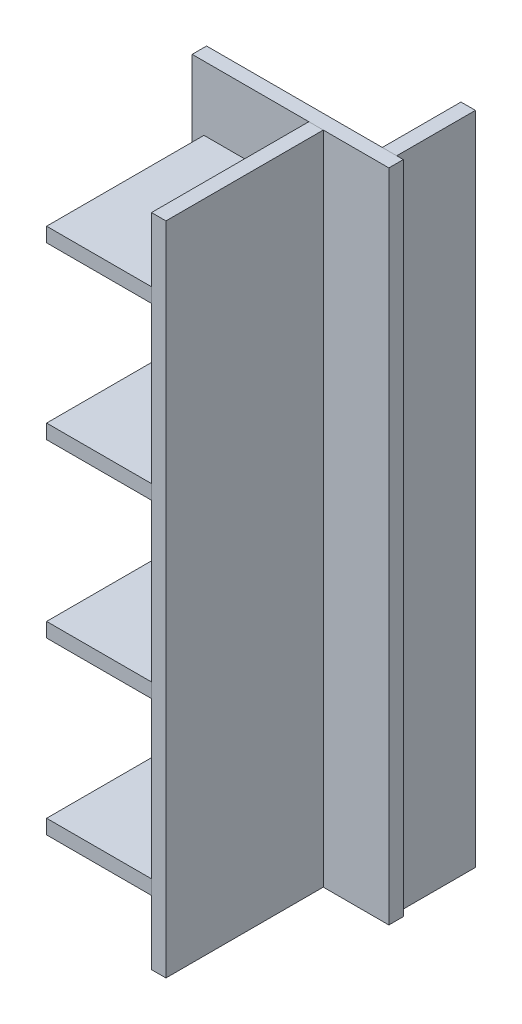
ISO-10303-21;
HEADER;
FILE_DESCRIPTION(('STEP AP214'),'2;1');
FILE_NAME('part.step','',(''),(''),'','','');
FILE_SCHEMA(('AUTOMOTIVE_DESIGN { 1 0 10303 214 1 1 1 1 }'));
ENDSEC;
DATA;
#1=APPLICATION_CONTEXT('core data for automotive mechanical design processes');
#2=APPLICATION_PROTOCOL_DEFINITION('international standard','automotive_design',2000,#1);
#3=PRODUCT_CONTEXT('',#1,'mechanical');
#4=PRODUCT('Part','Part','',(#3));
#5=PRODUCT_RELATED_PRODUCT_CATEGORY('part','',(#4));
#6=PRODUCT_DEFINITION_FORMATION('','',#4);
#7=PRODUCT_DEFINITION_CONTEXT('part definition',#1,'design');
#8=PRODUCT_DEFINITION('design','',#6,#7);
#9=PRODUCT_DEFINITION_SHAPE('','',#8);
#10=(LENGTH_UNIT() NAMED_UNIT(*) SI_UNIT(.MILLI.,.METRE.));
#11=(NAMED_UNIT(*) PLANE_ANGLE_UNIT() SI_UNIT($,.RADIAN.));
#12=(NAMED_UNIT(*) SI_UNIT($,.STERADIAN.) SOLID_ANGLE_UNIT());
#13=UNCERTAINTY_MEASURE_WITH_UNIT(LENGTH_MEASURE(1.E-05),#10,'distance_accuracy_value','');
#14=(GEOMETRIC_REPRESENTATION_CONTEXT(3) GLOBAL_UNCERTAINTY_ASSIGNED_CONTEXT((#13)) GLOBAL_UNIT_ASSIGNED_CONTEXT((#10,
#11,#12)) REPRESENTATION_CONTEXT('',''));
#15=CARTESIAN_POINT('',(0.,0.,0.));
#16=DIRECTION('',(0.,0.,1.));
#17=DIRECTION('',(1.,0.,0.));
#18=AXIS2_PLACEMENT_3D('',#15,#16,#17);
#19=CARTESIAN_POINT('',(140.,500.,-120.));
#20=DIRECTION('',(-1.,0.,0.));
#21=DIRECTION('',(0.,-1.,0.));
#22=AXIS2_PLACEMENT_3D('',#19,#20,#21);
#23=PLANE('',#22);
#24=DIRECTION('',(0.,-1.,0.));
#25=VECTOR('',#24,1.);
#26=CARTESIAN_POINT('',(140.,500.,0.));
#27=LINE('',#26,#25);
#28=CARTESIAN_POINT('',(140.,500.,0.));
#29=VERTEX_POINT('',#28);
#30=CARTESIAN_POINT('',(140.,-500.,0.));
#31=VERTEX_POINT('',#30);
#32=EDGE_CURVE('E107',#29,#31,#27,.T.);
#33=ORIENTED_EDGE('',*,*,#32,.T.);
#34=DIRECTION('',(0.,0.,1.));
#35=VECTOR('',#34,1.);
#36=CARTESIAN_POINT('',(140.,-500.,-120.));
#37=LINE('',#36,#35);
#38=CARTESIAN_POINT('',(140.,-500.,-120.));
#39=VERTEX_POINT('',#38);
#40=EDGE_CURVE('E12',#39,#31,#37,.T.);
#41=ORIENTED_EDGE('',*,*,#40,.F.);
#42=DIRECTION('',(0.,-1.,0.));
#43=VECTOR('',#42,1.);
#44=CARTESIAN_POINT('',(140.,500.,-120.));
#45=LINE('',#44,#43);
#46=CARTESIAN_POINT('',(140.,500.,-120.));
#47=VERTEX_POINT('',#46);
#48=EDGE_CURVE('E95',#47,#39,#45,.T.);
#49=ORIENTED_EDGE('',*,*,#48,.F.);
#50=DIRECTION('',(0.,0.,1.));
#51=VECTOR('',#50,1.);
#52=CARTESIAN_POINT('',(140.,500.,-120.));
#53=LINE('',#52,#51);
#54=EDGE_CURVE('E103',#47,#29,#53,.T.);
#55=ORIENTED_EDGE('',*,*,#54,.T.);
#56=EDGE_LOOP('',(#33,#41,#49,#55));
#57=FACE_BOUND('',#56,.T.);
#58=ADVANCED_FACE('F44',(#57),#23,.F.);
#59=CARTESIAN_POINT('',(140.,-500.,-120.));
#60=DIRECTION('',(0.,1.,0.));
#61=DIRECTION('',(0.,0.,1.));
#62=AXIS2_PLACEMENT_3D('',#59,#60,#61);
#63=PLANE('',#62);
#64=DIRECTION('',(-1.,0.,0.));
#65=VECTOR('',#64,1.);
#66=CARTESIAN_POINT('',(140.,-500.,0.));
#67=LINE('',#66,#65);
#68=CARTESIAN_POINT('',(118.,-500.,0.));
#69=VERTEX_POINT('',#68);
#70=EDGE_CURVE('E99',#31,#69,#67,.T.);
#71=ORIENTED_EDGE('',*,*,#70,.T.);
#72=DIRECTION('',(0.,0.,1.));
#73=VECTOR('',#72,1.);
#74=CARTESIAN_POINT('',(118.,-500.,-120.));
#75=LINE('',#74,#73);
#76=CARTESIAN_POINT('',(118.,-500.,-120.));
#77=VERTEX_POINT('',#76);
#78=EDGE_CURVE('E52',#77,#69,#75,.T.);
#79=ORIENTED_EDGE('',*,*,#78,.F.);
#80=DIRECTION('',(-1.,0.,0.));
#81=VECTOR('',#80,1.);
#82=CARTESIAN_POINT('',(140.,-500.,-120.));
#83=LINE('',#82,#81);
#84=EDGE_CURVE('E90',#39,#77,#83,.T.);
#85=ORIENTED_EDGE('',*,*,#84,.F.);
#86=ORIENTED_EDGE('',*,*,#40,.T.);
#87=EDGE_LOOP('',(#71,#79,#85,#86));
#88=FACE_BOUND('',#87,.T.);
#89=ADVANCED_FACE('F98',(#88),#63,.F.);
#90=CARTESIAN_POINT('',(118.,500.,-120.));
#91=DIRECTION('',(1.,0.,0.));
#92=DIRECTION('',(0.,1.,0.));
#93=AXIS2_PLACEMENT_3D('',#90,#91,#92);
#94=PLANE('',#93);
#95=DIRECTION('',(0.,1.,0.));
#96=VECTOR('',#95,1.);
#97=CARTESIAN_POINT('',(118.,500.,0.));
#98=LINE('',#97,#96);
#99=CARTESIAN_POINT('',(118.,500.,0.));
#100=VERTEX_POINT('',#99);
#101=EDGE_CURVE('E77',#69,#100,#98,.T.);
#102=ORIENTED_EDGE('',*,*,#101,.T.);
#103=DIRECTION('',(0.,0.,1.));
#104=VECTOR('',#103,1.);
#105=CARTESIAN_POINT('',(118.,500.,-120.));
#106=LINE('',#105,#104);
#107=CARTESIAN_POINT('',(118.,500.,-120.));
#108=VERTEX_POINT('',#107);
#109=EDGE_CURVE('E100',#108,#100,#106,.T.);
#110=ORIENTED_EDGE('',*,*,#109,.F.);
#111=DIRECTION('',(0.,1.,0.));
#112=VECTOR('',#111,1.);
#113=CARTESIAN_POINT('',(118.,500.,-120.));
#114=LINE('',#113,#112);
#115=EDGE_CURVE('E93',#77,#108,#114,.T.);
#116=ORIENTED_EDGE('',*,*,#115,.F.);
#117=ORIENTED_EDGE('',*,*,#78,.T.);
#118=EDGE_LOOP('',(#102,#110,#116,#117));
#119=FACE_BOUND('',#118,.T.);
#120=ADVANCED_FACE('F101',(#119),#94,.F.);
#121=CARTESIAN_POINT('',(140.,500.,-120.));
#122=DIRECTION('',(0.,-1.,0.));
#123=DIRECTION('',(0.,0.,-1.));
#124=AXIS2_PLACEMENT_3D('',#121,#122,#123);
#125=PLANE('',#124);
#126=DIRECTION('',(1.,0.,0.));
#127=VECTOR('',#126,1.);
#128=CARTESIAN_POINT('',(140.,500.,0.));
#129=LINE('',#128,#127);
#130=EDGE_CURVE('E83',#100,#29,#129,.T.);
#131=ORIENTED_EDGE('',*,*,#130,.T.);
#132=ORIENTED_EDGE('',*,*,#54,.F.);
#133=DIRECTION('',(1.,0.,0.));
#134=VECTOR('',#133,1.);
#135=CARTESIAN_POINT('',(140.,500.,-120.));
#136=LINE('',#135,#134);
#137=EDGE_CURVE('E60',#108,#47,#136,.T.);
#138=ORIENTED_EDGE('',*,*,#137,.F.);
#139=ORIENTED_EDGE('',*,*,#109,.T.);
#140=EDGE_LOOP('',(#131,#132,#138,#139));
#141=FACE_BOUND('',#140,.T.);
#142=ADVANCED_FACE('F114',(#141),#125,.F.);
#143=CARTESIAN_POINT('',(0.,0.,-120.));
#144=DIRECTION('',(0.,0.,-1.));
#145=DIRECTION('',(-1.,0.,0.));
#146=AXIS2_PLACEMENT_3D('',#143,#144,#145);
#147=PLANE('',#146);
#148=ORIENTED_EDGE('',*,*,#48,.T.);
#149=ORIENTED_EDGE('',*,*,#84,.T.);
#150=ORIENTED_EDGE('',*,*,#115,.T.);
#151=ORIENTED_EDGE('',*,*,#137,.T.);
#152=EDGE_LOOP('',(#148,#149,#150,#151));
#153=FACE_BOUND('',#152,.T.);
#154=ADVANCED_FACE('F91',(#153),#147,.T.);
#155=CARTESIAN_POINT('',(0.,0.,0.));
#156=DIRECTION('',(0.,0.,-1.));
#157=DIRECTION('',(-1.,0.,0.));
#158=AXIS2_PLACEMENT_3D('',#155,#156,#157);
#159=PLANE('',#158);
#160=ORIENTED_EDGE('',*,*,#32,.F.);
#161=ORIENTED_EDGE('',*,*,#130,.F.);
#162=ORIENTED_EDGE('',*,*,#101,.F.);
#163=ORIENTED_EDGE('',*,*,#70,.F.);
#164=EDGE_LOOP('',(#160,#161,#162,#163));
#165=FACE_BOUND('',#164,.T.);
#166=ADVANCED_FACE('F117',(#165),#159,.F.);
#167=CLOSED_SHELL('',(#58,#89,#120,#142,#154,#166));
#168=MANIFOLD_SOLID_BREP('B2',#167);
#169=CARTESIAN_POINT('',(27.9999999999999,142.,262.));
#170=DIRECTION('',(0.,-1.,0.));
#171=DIRECTION('',(0.,0.,-1.));
#172=AXIS2_PLACEMENT_3D('',#169,#170,#171);
#173=PLANE('',#172);
#174=DIRECTION('',(-1.,0.,0.));
#175=VECTOR('',#174,1.);
#176=CARTESIAN_POINT('',(27.9999999999999,142.,22.));
#177=LINE('',#176,#175);
#178=CARTESIAN_POINT('',(27.9999999999999,142.,22.));
#179=VERTEX_POINT('',#178);
#180=CARTESIAN_POINT('',(-132.,142.,22.));
#181=VERTEX_POINT('',#180);
#182=EDGE_CURVE('E241',#179,#181,#177,.T.);
#183=ORIENTED_EDGE('',*,*,#182,.T.);
#184=DIRECTION('',(0.,0.,-1.));
#185=VECTOR('',#184,1.);
#186=CARTESIAN_POINT('',(-132.,142.,262.));
#187=LINE('',#186,#185);
#188=CARTESIAN_POINT('',(-132.,142.,262.));
#189=VERTEX_POINT('',#188);
#190=EDGE_CURVE('E42',#189,#181,#187,.T.);
#191=ORIENTED_EDGE('',*,*,#190,.F.);
#192=DIRECTION('',(-1.,0.,0.));
#193=VECTOR('',#192,1.);
#194=CARTESIAN_POINT('',(27.9999999999999,142.,262.));
#195=LINE('',#194,#193);
#196=CARTESIAN_POINT('',(27.9999999999999,142.,262.));
#197=VERTEX_POINT('',#196);
#198=EDGE_CURVE('E229',#197,#189,#195,.T.);
#199=ORIENTED_EDGE('',*,*,#198,.F.);
#200=DIRECTION('',(0.,0.,-1.));
#201=VECTOR('',#200,1.);
#202=CARTESIAN_POINT('',(27.9999999999999,142.,262.));
#203=LINE('',#202,#201);
#204=EDGE_CURVE('E237',#197,#179,#203,.T.);
#205=ORIENTED_EDGE('',*,*,#204,.T.);
#206=EDGE_LOOP('',(#183,#191,#199,#205));
#207=FACE_BOUND('',#206,.T.);
#208=ADVANCED_FACE('F178',(#207),#173,.F.);
#209=CARTESIAN_POINT('',(-132.,142.,262.));
#210=DIRECTION('',(1.,0.,0.));
#211=DIRECTION('',(0.,0.,-1.));
#212=AXIS2_PLACEMENT_3D('',#209,#210,#211);
#213=PLANE('',#212);
#214=DIRECTION('',(0.,-1.,0.));
#215=VECTOR('',#214,1.);
#216=CARTESIAN_POINT('',(-132.,142.,22.));
#217=LINE('',#216,#215);
#218=CARTESIAN_POINT('',(-132.,120.,22.));
#219=VERTEX_POINT('',#218);
#220=EDGE_CURVE('E233',#181,#219,#217,.T.);
#221=ORIENTED_EDGE('',*,*,#220,.T.);
#222=DIRECTION('',(0.,0.,-1.));
#223=VECTOR('',#222,1.);
#224=CARTESIAN_POINT('',(-132.,120.,262.));
#225=LINE('',#224,#223);
#226=CARTESIAN_POINT('',(-132.,120.,262.));
#227=VERTEX_POINT('',#226);
#228=EDGE_CURVE('E186',#227,#219,#225,.T.);
#229=ORIENTED_EDGE('',*,*,#228,.F.);
#230=DIRECTION('',(0.,-1.,0.));
#231=VECTOR('',#230,1.);
#232=CARTESIAN_POINT('',(-132.,142.,262.));
#233=LINE('',#232,#231);
#234=EDGE_CURVE('E224',#189,#227,#233,.T.);
#235=ORIENTED_EDGE('',*,*,#234,.F.);
#236=ORIENTED_EDGE('',*,*,#190,.T.);
#237=EDGE_LOOP('',(#221,#229,#235,#236));
#238=FACE_BOUND('',#237,.T.);
#239=ADVANCED_FACE('F232',(#238),#213,.F.);
#240=CARTESIAN_POINT('',(27.9999999999999,120.,262.));
#241=DIRECTION('',(0.,1.,0.));
#242=DIRECTION('',(-1.,0.,0.));
#243=AXIS2_PLACEMENT_3D('',#240,#241,#242);
#244=PLANE('',#243);
#245=DIRECTION('',(1.,0.,0.));
#246=VECTOR('',#245,1.);
#247=CARTESIAN_POINT('',(27.9999999999999,120.,22.));
#248=LINE('',#247,#246);
#249=CARTESIAN_POINT('',(27.9999999999999,120.,22.));
#250=VERTEX_POINT('',#249);
#251=EDGE_CURVE('E211',#219,#250,#248,.T.);
#252=ORIENTED_EDGE('',*,*,#251,.T.);
#253=DIRECTION('',(0.,0.,-1.));
#254=VECTOR('',#253,1.);
#255=CARTESIAN_POINT('',(27.9999999999999,120.,262.));
#256=LINE('',#255,#254);
#257=CARTESIAN_POINT('',(27.9999999999999,120.,262.));
#258=VERTEX_POINT('',#257);
#259=EDGE_CURVE('E234',#258,#250,#256,.T.);
#260=ORIENTED_EDGE('',*,*,#259,.F.);
#261=DIRECTION('',(1.,0.,0.));
#262=VECTOR('',#261,1.);
#263=CARTESIAN_POINT('',(27.9999999999999,120.,262.));
#264=LINE('',#263,#262);
#265=EDGE_CURVE('E227',#227,#258,#264,.T.);
#266=ORIENTED_EDGE('',*,*,#265,.F.);
#267=ORIENTED_EDGE('',*,*,#228,.T.);
#268=EDGE_LOOP('',(#252,#260,#266,#267));
#269=FACE_BOUND('',#268,.T.);
#270=ADVANCED_FACE('F235',(#269),#244,.F.);
#271=CARTESIAN_POINT('',(27.9999999999999,142.,262.));
#272=DIRECTION('',(-1.,0.,0.));
#273=DIRECTION('',(0.,0.,1.));
#274=AXIS2_PLACEMENT_3D('',#271,#272,#273);
#275=PLANE('',#274);
#276=DIRECTION('',(0.,1.,0.));
#277=VECTOR('',#276,1.);
#278=CARTESIAN_POINT('',(27.9999999999999,142.,22.));
#279=LINE('',#278,#277);
#280=EDGE_CURVE('E217',#250,#179,#279,.T.);
#281=ORIENTED_EDGE('',*,*,#280,.T.);
#282=ORIENTED_EDGE('',*,*,#204,.F.);
#283=DIRECTION('',(0.,1.,0.));
#284=VECTOR('',#283,1.);
#285=CARTESIAN_POINT('',(27.9999999999999,142.,262.));
#286=LINE('',#285,#284);
#287=EDGE_CURVE('E194',#258,#197,#286,.T.);
#288=ORIENTED_EDGE('',*,*,#287,.F.);
#289=ORIENTED_EDGE('',*,*,#259,.T.);
#290=EDGE_LOOP('',(#281,#282,#288,#289));
#291=FACE_BOUND('',#290,.T.);
#292=ADVANCED_FACE('F248',(#291),#275,.F.);
#293=CARTESIAN_POINT('',(0.,0.,262.));
#294=DIRECTION('',(0.,0.,1.));
#295=DIRECTION('',(1.,0.,0.));
#296=AXIS2_PLACEMENT_3D('',#293,#294,#295);
#297=PLANE('',#296);
#298=ORIENTED_EDGE('',*,*,#198,.T.);
#299=ORIENTED_EDGE('',*,*,#234,.T.);
#300=ORIENTED_EDGE('',*,*,#265,.T.);
#301=ORIENTED_EDGE('',*,*,#287,.T.);
#302=EDGE_LOOP('',(#298,#299,#300,#301));
#303=FACE_BOUND('',#302,.T.);
#304=ADVANCED_FACE('F225',(#303),#297,.T.);
#305=CARTESIAN_POINT('',(0.,0.,22.));
#306=DIRECTION('',(0.,0.,1.));
#307=DIRECTION('',(1.,0.,0.));
#308=AXIS2_PLACEMENT_3D('',#305,#306,#307);
#309=PLANE('',#308);
#310=ORIENTED_EDGE('',*,*,#182,.F.);
#311=ORIENTED_EDGE('',*,*,#280,.F.);
#312=ORIENTED_EDGE('',*,*,#251,.F.);
#313=ORIENTED_EDGE('',*,*,#220,.F.);
#314=EDGE_LOOP('',(#310,#311,#312,#313));
#315=FACE_BOUND('',#314,.T.);
#316=ADVANCED_FACE('F251',(#315),#309,.F.);
#317=CLOSED_SHELL('',(#208,#239,#270,#292,#304,#316));
#318=MANIFOLD_SOLID_BREP('B6',#317);
#319=CARTESIAN_POINT('',(27.9999999999999,402.,262.));
#320=DIRECTION('',(0.,-1.,0.));
#321=DIRECTION('',(0.,0.,-1.));
#322=AXIS2_PLACEMENT_3D('',#319,#320,#321);
#323=PLANE('',#322);
#324=DIRECTION('',(-1.,0.,0.));
#325=VECTOR('',#324,1.);
#326=CARTESIAN_POINT('',(27.9999999999999,402.,22.));
#327=LINE('',#326,#325);
#328=CARTESIAN_POINT('',(27.9999999999999,402.,22.));
#329=VERTEX_POINT('',#328);
#330=CARTESIAN_POINT('',(-132.,402.,22.));
#331=VERTEX_POINT('',#330);
#332=EDGE_CURVE('E375',#329,#331,#327,.T.);
#333=ORIENTED_EDGE('',*,*,#332,.T.);
#334=DIRECTION('',(0.,0.,-1.));
#335=VECTOR('',#334,1.);
#336=CARTESIAN_POINT('',(-132.,402.,262.));
#337=LINE('',#336,#335);
#338=CARTESIAN_POINT('',(-132.,402.,262.));
#339=VERTEX_POINT('',#338);
#340=EDGE_CURVE('E176',#339,#331,#337,.T.);
#341=ORIENTED_EDGE('',*,*,#340,.F.);
#342=DIRECTION('',(-1.,0.,0.));
#343=VECTOR('',#342,1.);
#344=CARTESIAN_POINT('',(27.9999999999999,402.,262.));
#345=LINE('',#344,#343);
#346=CARTESIAN_POINT('',(27.9999999999999,402.,262.));
#347=VERTEX_POINT('',#346);
#348=EDGE_CURVE('E363',#347,#339,#345,.T.);
#349=ORIENTED_EDGE('',*,*,#348,.F.);
#350=DIRECTION('',(0.,0.,-1.));
#351=VECTOR('',#350,1.);
#352=CARTESIAN_POINT('',(27.9999999999999,402.,262.));
#353=LINE('',#352,#351);
#354=EDGE_CURVE('E371',#347,#329,#353,.T.);
#355=ORIENTED_EDGE('',*,*,#354,.T.);
#356=EDGE_LOOP('',(#333,#341,#349,#355));
#357=FACE_BOUND('',#356,.T.);
#358=ADVANCED_FACE('F312',(#357),#323,.F.);
#359=CARTESIAN_POINT('',(-132.,402.,262.));
#360=DIRECTION('',(1.,0.,0.));
#361=DIRECTION('',(0.,0.,-1.));
#362=AXIS2_PLACEMENT_3D('',#359,#360,#361);
#363=PLANE('',#362);
#364=DIRECTION('',(0.,-1.,0.));
#365=VECTOR('',#364,1.);
#366=CARTESIAN_POINT('',(-132.,402.,22.));
#367=LINE('',#366,#365);
#368=CARTESIAN_POINT('',(-132.,380.,22.));
#369=VERTEX_POINT('',#368);
#370=EDGE_CURVE('E367',#331,#369,#367,.T.);
#371=ORIENTED_EDGE('',*,*,#370,.T.);
#372=DIRECTION('',(0.,0.,-1.));
#373=VECTOR('',#372,1.);
#374=CARTESIAN_POINT('',(-132.,380.,262.));
#375=LINE('',#374,#373);
#376=CARTESIAN_POINT('',(-132.,380.,262.));
#377=VERTEX_POINT('',#376);
#378=EDGE_CURVE('E320',#377,#369,#375,.T.);
#379=ORIENTED_EDGE('',*,*,#378,.F.);
#380=DIRECTION('',(0.,-1.,0.));
#381=VECTOR('',#380,1.);
#382=CARTESIAN_POINT('',(-132.,402.,262.));
#383=LINE('',#382,#381);
#384=EDGE_CURVE('E358',#339,#377,#383,.T.);
#385=ORIENTED_EDGE('',*,*,#384,.F.);
#386=ORIENTED_EDGE('',*,*,#340,.T.);
#387=EDGE_LOOP('',(#371,#379,#385,#386));
#388=FACE_BOUND('',#387,.T.);
#389=ADVANCED_FACE('F366',(#388),#363,.F.);
#390=CARTESIAN_POINT('',(27.9999999999999,380.,262.));
#391=DIRECTION('',(0.,1.,0.));
#392=DIRECTION('',(0.,0.,1.));
#393=AXIS2_PLACEMENT_3D('',#390,#391,#392);
#394=PLANE('',#393);
#395=DIRECTION('',(1.,0.,0.));
#396=VECTOR('',#395,1.);
#397=CARTESIAN_POINT('',(27.9999999999999,380.,22.));
#398=LINE('',#397,#396);
#399=CARTESIAN_POINT('',(27.9999999999999,380.,22.));
#400=VERTEX_POINT('',#399);
#401=EDGE_CURVE('E345',#369,#400,#398,.T.);
#402=ORIENTED_EDGE('',*,*,#401,.T.);
#403=DIRECTION('',(0.,0.,-1.));
#404=VECTOR('',#403,1.);
#405=CARTESIAN_POINT('',(27.9999999999999,380.,262.));
#406=LINE('',#405,#404);
#407=CARTESIAN_POINT('',(27.9999999999999,380.,262.));
#408=VERTEX_POINT('',#407);
#409=EDGE_CURVE('E368',#408,#400,#406,.T.);
#410=ORIENTED_EDGE('',*,*,#409,.F.);
#411=DIRECTION('',(1.,0.,0.));
#412=VECTOR('',#411,1.);
#413=CARTESIAN_POINT('',(27.9999999999999,380.,262.));
#414=LINE('',#413,#412);
#415=EDGE_CURVE('E361',#377,#408,#414,.T.);
#416=ORIENTED_EDGE('',*,*,#415,.F.);
#417=ORIENTED_EDGE('',*,*,#378,.T.);
#418=EDGE_LOOP('',(#402,#410,#416,#417));
#419=FACE_BOUND('',#418,.T.);
#420=ADVANCED_FACE('F369',(#419),#394,.F.);
#421=CARTESIAN_POINT('',(27.9999999999999,402.,262.));
#422=DIRECTION('',(-1.,0.,0.));
#423=DIRECTION('',(0.,0.,1.));
#424=AXIS2_PLACEMENT_3D('',#421,#422,#423);
#425=PLANE('',#424);
#426=DIRECTION('',(0.,1.,0.));
#427=VECTOR('',#426,1.);
#428=CARTESIAN_POINT('',(27.9999999999999,402.,22.));
#429=LINE('',#428,#427);
#430=EDGE_CURVE('E351',#400,#329,#429,.T.);
#431=ORIENTED_EDGE('',*,*,#430,.T.);
#432=ORIENTED_EDGE('',*,*,#354,.F.);
#433=DIRECTION('',(0.,1.,0.));
#434=VECTOR('',#433,1.);
#435=CARTESIAN_POINT('',(27.9999999999999,402.,262.));
#436=LINE('',#435,#434);
#437=EDGE_CURVE('E328',#408,#347,#436,.T.);
#438=ORIENTED_EDGE('',*,*,#437,.F.);
#439=ORIENTED_EDGE('',*,*,#409,.T.);
#440=EDGE_LOOP('',(#431,#432,#438,#439));
#441=FACE_BOUND('',#440,.T.);
#442=ADVANCED_FACE('F382',(#441),#425,.F.);
#443=CARTESIAN_POINT('',(0.,0.,262.));
#444=DIRECTION('',(0.,0.,1.));
#445=DIRECTION('',(1.,0.,0.));
#446=AXIS2_PLACEMENT_3D('',#443,#444,#445);
#447=PLANE('',#446);
#448=ORIENTED_EDGE('',*,*,#348,.T.);
#449=ORIENTED_EDGE('',*,*,#384,.T.);
#450=ORIENTED_EDGE('',*,*,#415,.T.);
#451=ORIENTED_EDGE('',*,*,#437,.T.);
#452=EDGE_LOOP('',(#448,#449,#450,#451));
#453=FACE_BOUND('',#452,.T.);
#454=ADVANCED_FACE('F359',(#453),#447,.T.);
#455=CARTESIAN_POINT('',(0.,0.,22.));
#456=DIRECTION('',(0.,0.,1.));
#457=DIRECTION('',(1.,0.,0.));
#458=AXIS2_PLACEMENT_3D('',#455,#456,#457);
#459=PLANE('',#458);
#460=ORIENTED_EDGE('',*,*,#332,.F.);
#461=ORIENTED_EDGE('',*,*,#430,.F.);
#462=ORIENTED_EDGE('',*,*,#401,.F.);
#463=ORIENTED_EDGE('',*,*,#370,.F.);
#464=EDGE_LOOP('',(#460,#461,#462,#463));
#465=FACE_BOUND('',#464,.T.);
#466=ADVANCED_FACE('F385',(#465),#459,.F.);
#467=CLOSED_SHELL('',(#358,#389,#420,#442,#454,#466));
#468=MANIFOLD_SOLID_BREP('B36',#467);
#469=CARTESIAN_POINT('',(27.9999999999999,-142.,262.));
#470=DIRECTION('',(-1.,0.,0.));
#471=DIRECTION('',(0.,0.,1.));
#472=AXIS2_PLACEMENT_3D('',#469,#470,#471);
#473=PLANE('',#472);
#474=DIRECTION('',(0.,1.,0.));
#475=VECTOR('',#474,1.);
#476=CARTESIAN_POINT('',(27.9999999999999,-142.,22.));
#477=LINE('',#476,#475);
#478=CARTESIAN_POINT('',(27.9999999999999,-142.,22.));
#479=VERTEX_POINT('',#478);
#480=CARTESIAN_POINT('',(27.9999999999999,-120.,22.));
#481=VERTEX_POINT('',#480);
#482=EDGE_CURVE('E509',#479,#481,#477,.T.);
#483=ORIENTED_EDGE('',*,*,#482,.T.);
#484=DIRECTION('',(0.,0.,-1.));
#485=VECTOR('',#484,1.);
#486=CARTESIAN_POINT('',(27.9999999999999,-120.,262.));
#487=LINE('',#486,#485);
#488=CARTESIAN_POINT('',(27.9999999999999,-120.,262.));
#489=VERTEX_POINT('',#488);
#490=EDGE_CURVE('E310',#489,#481,#487,.T.);
#491=ORIENTED_EDGE('',*,*,#490,.F.);
#492=DIRECTION('',(0.,1.,0.));
#493=VECTOR('',#492,1.);
#494=CARTESIAN_POINT('',(27.9999999999999,-142.,262.));
#495=LINE('',#494,#493);
#496=CARTESIAN_POINT('',(27.9999999999999,-142.,262.));
#497=VERTEX_POINT('',#496);
#498=EDGE_CURVE('E497',#497,#489,#495,.T.);
#499=ORIENTED_EDGE('',*,*,#498,.F.);
#500=DIRECTION('',(0.,0.,-1.));
#501=VECTOR('',#500,1.);
#502=CARTESIAN_POINT('',(27.9999999999999,-142.,262.));
#503=LINE('',#502,#501);
#504=EDGE_CURVE('E505',#497,#479,#503,.T.);
#505=ORIENTED_EDGE('',*,*,#504,.T.);
#506=EDGE_LOOP('',(#483,#491,#499,#505));
#507=FACE_BOUND('',#506,.T.);
#508=ADVANCED_FACE('F446',(#507),#473,.F.);
#509=CARTESIAN_POINT('',(27.9999999999999,-120.,262.));
#510=DIRECTION('',(0.,-1.,0.));
#511=DIRECTION('',(1.,0.,0.));
#512=AXIS2_PLACEMENT_3D('',#509,#510,#511);
#513=PLANE('',#512);
#514=DIRECTION('',(-1.,0.,0.));
#515=VECTOR('',#514,1.);
#516=CARTESIAN_POINT('',(27.9999999999999,-120.,22.));
#517=LINE('',#516,#515);
#518=CARTESIAN_POINT('',(-132.,-120.,22.));
#519=VERTEX_POINT('',#518);
#520=EDGE_CURVE('E501',#481,#519,#517,.T.);
#521=ORIENTED_EDGE('',*,*,#520,.T.);
#522=DIRECTION('',(0.,0.,-1.));
#523=VECTOR('',#522,1.);
#524=CARTESIAN_POINT('',(-132.,-120.,262.));
#525=LINE('',#524,#523);
#526=CARTESIAN_POINT('',(-132.,-120.,262.));
#527=VERTEX_POINT('',#526);
#528=EDGE_CURVE('E454',#527,#519,#525,.T.);
#529=ORIENTED_EDGE('',*,*,#528,.F.);
#530=DIRECTION('',(-1.,0.,0.));
#531=VECTOR('',#530,1.);
#532=CARTESIAN_POINT('',(27.9999999999999,-120.,262.));
#533=LINE('',#532,#531);
#534=EDGE_CURVE('E492',#489,#527,#533,.T.);
#535=ORIENTED_EDGE('',*,*,#534,.F.);
#536=ORIENTED_EDGE('',*,*,#490,.T.);
#537=EDGE_LOOP('',(#521,#529,#535,#536));
#538=FACE_BOUND('',#537,.T.);
#539=ADVANCED_FACE('F500',(#538),#513,.F.);
#540=CARTESIAN_POINT('',(-132.,-142.,262.));
#541=DIRECTION('',(1.,0.,0.));
#542=DIRECTION('',(0.,0.,-1.));
#543=AXIS2_PLACEMENT_3D('',#540,#541,#542);
#544=PLANE('',#543);
#545=DIRECTION('',(0.,-1.,0.));
#546=VECTOR('',#545,1.);
#547=CARTESIAN_POINT('',(-132.,-142.,22.));
#548=LINE('',#547,#546);
#549=CARTESIAN_POINT('',(-132.,-142.,22.));
#550=VERTEX_POINT('',#549);
#551=EDGE_CURVE('E479',#519,#550,#548,.T.);
#552=ORIENTED_EDGE('',*,*,#551,.T.);
#553=DIRECTION('',(0.,0.,-1.));
#554=VECTOR('',#553,1.);
#555=CARTESIAN_POINT('',(-132.,-142.,262.));
#556=LINE('',#555,#554);
#557=CARTESIAN_POINT('',(-132.,-142.,262.));
#558=VERTEX_POINT('',#557);
#559=EDGE_CURVE('E502',#558,#550,#556,.T.);
#560=ORIENTED_EDGE('',*,*,#559,.F.);
#561=DIRECTION('',(0.,-1.,0.));
#562=VECTOR('',#561,1.);
#563=CARTESIAN_POINT('',(-132.,-142.,262.));
#564=LINE('',#563,#562);
#565=EDGE_CURVE('E495',#527,#558,#564,.T.);
#566=ORIENTED_EDGE('',*,*,#565,.F.);
#567=ORIENTED_EDGE('',*,*,#528,.T.);
#568=EDGE_LOOP('',(#552,#560,#566,#567));
#569=FACE_BOUND('',#568,.T.);
#570=ADVANCED_FACE('F503',(#569),#544,.F.);
#571=CARTESIAN_POINT('',(27.9999999999999,-142.,262.));
#572=DIRECTION('',(0.,1.,0.));
#573=DIRECTION('',(0.,0.,1.));
#574=AXIS2_PLACEMENT_3D('',#571,#572,#573);
#575=PLANE('',#574);
#576=DIRECTION('',(1.,0.,0.));
#577=VECTOR('',#576,1.);
#578=CARTESIAN_POINT('',(27.9999999999999,-142.,22.));
#579=LINE('',#578,#577);
#580=EDGE_CURVE('E485',#550,#479,#579,.T.);
#581=ORIENTED_EDGE('',*,*,#580,.T.);
#582=ORIENTED_EDGE('',*,*,#504,.F.);
#583=DIRECTION('',(1.,0.,0.));
#584=VECTOR('',#583,1.);
#585=CARTESIAN_POINT('',(27.9999999999999,-142.,262.));
#586=LINE('',#585,#584);
#587=EDGE_CURVE('E462',#558,#497,#586,.T.);
#588=ORIENTED_EDGE('',*,*,#587,.F.);
#589=ORIENTED_EDGE('',*,*,#559,.T.);
#590=EDGE_LOOP('',(#581,#582,#588,#589));
#591=FACE_BOUND('',#590,.T.);
#592=ADVANCED_FACE('F516',(#591),#575,.F.);
#593=CARTESIAN_POINT('',(0.,0.,262.));
#594=DIRECTION('',(0.,0.,1.));
#595=DIRECTION('',(1.,0.,0.));
#596=AXIS2_PLACEMENT_3D('',#593,#594,#595);
#597=PLANE('',#596);
#598=ORIENTED_EDGE('',*,*,#498,.T.);
#599=ORIENTED_EDGE('',*,*,#534,.T.);
#600=ORIENTED_EDGE('',*,*,#565,.T.);
#601=ORIENTED_EDGE('',*,*,#587,.T.);
#602=EDGE_LOOP('',(#598,#599,#600,#601));
#603=FACE_BOUND('',#602,.T.);
#604=ADVANCED_FACE('F493',(#603),#597,.T.);
#605=CARTESIAN_POINT('',(0.,0.,22.));
#606=DIRECTION('',(0.,0.,1.));
#607=DIRECTION('',(1.,0.,0.));
#608=AXIS2_PLACEMENT_3D('',#605,#606,#607);
#609=PLANE('',#608);
#610=ORIENTED_EDGE('',*,*,#482,.F.);
#611=ORIENTED_EDGE('',*,*,#580,.F.);
#612=ORIENTED_EDGE('',*,*,#551,.F.);
#613=ORIENTED_EDGE('',*,*,#520,.F.);
#614=EDGE_LOOP('',(#610,#611,#612,#613));
#615=FACE_BOUND('',#614,.T.);
#616=ADVANCED_FACE('F519',(#615),#609,.F.);
#617=CLOSED_SHELL('',(#508,#539,#570,#592,#604,#616));
#618=MANIFOLD_SOLID_BREP('B170',#617);
#619=CARTESIAN_POINT('',(27.9999999999999,-402.,262.));
#620=DIRECTION('',(-1.,0.,0.));
#621=DIRECTION('',(0.,0.,1.));
#622=AXIS2_PLACEMENT_3D('',#619,#620,#621);
#623=PLANE('',#622);
#624=DIRECTION('',(0.,1.,0.));
#625=VECTOR('',#624,1.);
#626=CARTESIAN_POINT('',(27.9999999999999,-402.,22.));
#627=LINE('',#626,#625);
#628=CARTESIAN_POINT('',(27.9999999999999,-402.,22.));
#629=VERTEX_POINT('',#628);
#630=CARTESIAN_POINT('',(27.9999999999999,-380.,22.));
#631=VERTEX_POINT('',#630);
#632=EDGE_CURVE('E643',#629,#631,#627,.T.);
#633=ORIENTED_EDGE('',*,*,#632,.T.);
#634=DIRECTION('',(0.,0.,-1.));
#635=VECTOR('',#634,1.);
#636=CARTESIAN_POINT('',(27.9999999999999,-380.,262.));
#637=LINE('',#636,#635);
#638=CARTESIAN_POINT('',(27.9999999999999,-380.,262.));
#639=VERTEX_POINT('',#638);
#640=EDGE_CURVE('E444',#639,#631,#637,.T.);
#641=ORIENTED_EDGE('',*,*,#640,.F.);
#642=DIRECTION('',(0.,1.,0.));
#643=VECTOR('',#642,1.);
#644=CARTESIAN_POINT('',(27.9999999999999,-402.,262.));
#645=LINE('',#644,#643);
#646=CARTESIAN_POINT('',(27.9999999999999,-402.,262.));
#647=VERTEX_POINT('',#646);
#648=EDGE_CURVE('E631',#647,#639,#645,.T.);
#649=ORIENTED_EDGE('',*,*,#648,.F.);
#650=DIRECTION('',(0.,0.,-1.));
#651=VECTOR('',#650,1.);
#652=CARTESIAN_POINT('',(27.9999999999999,-402.,262.));
#653=LINE('',#652,#651);
#654=EDGE_CURVE('E639',#647,#629,#653,.T.);
#655=ORIENTED_EDGE('',*,*,#654,.T.);
#656=EDGE_LOOP('',(#633,#641,#649,#655));
#657=FACE_BOUND('',#656,.T.);
#658=ADVANCED_FACE('F580',(#657),#623,.F.);
#659=CARTESIAN_POINT('',(27.9999999999999,-380.,262.));
#660=DIRECTION('',(0.,-1.,0.));
#661=DIRECTION('',(0.,0.,-1.));
#662=AXIS2_PLACEMENT_3D('',#659,#660,#661);
#663=PLANE('',#662);
#664=DIRECTION('',(-1.,0.,0.));
#665=VECTOR('',#664,1.);
#666=CARTESIAN_POINT('',(27.9999999999999,-380.,22.));
#667=LINE('',#666,#665);
#668=CARTESIAN_POINT('',(-132.,-380.,22.));
#669=VERTEX_POINT('',#668);
#670=EDGE_CURVE('E635',#631,#669,#667,.T.);
#671=ORIENTED_EDGE('',*,*,#670,.T.);
#672=DIRECTION('',(0.,0.,-1.));
#673=VECTOR('',#672,1.);
#674=CARTESIAN_POINT('',(-132.,-380.,262.));
#675=LINE('',#674,#673);
#676=CARTESIAN_POINT('',(-132.,-380.,262.));
#677=VERTEX_POINT('',#676);
#678=EDGE_CURVE('E588',#677,#669,#675,.T.);
#679=ORIENTED_EDGE('',*,*,#678,.F.);
#680=DIRECTION('',(-1.,0.,0.));
#681=VECTOR('',#680,1.);
#682=CARTESIAN_POINT('',(27.9999999999999,-380.,262.));
#683=LINE('',#682,#681);
#684=EDGE_CURVE('E626',#639,#677,#683,.T.);
#685=ORIENTED_EDGE('',*,*,#684,.F.);
#686=ORIENTED_EDGE('',*,*,#640,.T.);
#687=EDGE_LOOP('',(#671,#679,#685,#686));
#688=FACE_BOUND('',#687,.T.);
#689=ADVANCED_FACE('F634',(#688),#663,.F.);
#690=CARTESIAN_POINT('',(-132.,-402.,262.));
#691=DIRECTION('',(1.,0.,0.));
#692=DIRECTION('',(0.,0.,-1.));
#693=AXIS2_PLACEMENT_3D('',#690,#691,#692);
#694=PLANE('',#693);
#695=DIRECTION('',(0.,-1.,0.));
#696=VECTOR('',#695,1.);
#697=CARTESIAN_POINT('',(-132.,-402.,22.));
#698=LINE('',#697,#696);
#699=CARTESIAN_POINT('',(-132.,-402.,22.));
#700=VERTEX_POINT('',#699);
#701=EDGE_CURVE('E613',#669,#700,#698,.T.);
#702=ORIENTED_EDGE('',*,*,#701,.T.);
#703=DIRECTION('',(0.,0.,-1.));
#704=VECTOR('',#703,1.);
#705=CARTESIAN_POINT('',(-132.,-402.,262.));
#706=LINE('',#705,#704);
#707=CARTESIAN_POINT('',(-132.,-402.,262.));
#708=VERTEX_POINT('',#707);
#709=EDGE_CURVE('E636',#708,#700,#706,.T.);
#710=ORIENTED_EDGE('',*,*,#709,.F.);
#711=DIRECTION('',(0.,-1.,0.));
#712=VECTOR('',#711,1.);
#713=CARTESIAN_POINT('',(-132.,-402.,262.));
#714=LINE('',#713,#712);
#715=EDGE_CURVE('E629',#677,#708,#714,.T.);
#716=ORIENTED_EDGE('',*,*,#715,.F.);
#717=ORIENTED_EDGE('',*,*,#678,.T.);
#718=EDGE_LOOP('',(#702,#710,#716,#717));
#719=FACE_BOUND('',#718,.T.);
#720=ADVANCED_FACE('F637',(#719),#694,.F.);
#721=CARTESIAN_POINT('',(27.9999999999999,-402.,262.));
#722=DIRECTION('',(0.,1.,0.));
#723=DIRECTION('',(0.,0.,1.));
#724=AXIS2_PLACEMENT_3D('',#721,#722,#723);
#725=PLANE('',#724);
#726=DIRECTION('',(1.,0.,0.));
#727=VECTOR('',#726,1.);
#728=CARTESIAN_POINT('',(27.9999999999999,-402.,22.));
#729=LINE('',#728,#727);
#730=EDGE_CURVE('E619',#700,#629,#729,.T.);
#731=ORIENTED_EDGE('',*,*,#730,.T.);
#732=ORIENTED_EDGE('',*,*,#654,.F.);
#733=DIRECTION('',(1.,0.,0.));
#734=VECTOR('',#733,1.);
#735=CARTESIAN_POINT('',(27.9999999999999,-402.,262.));
#736=LINE('',#735,#734);
#737=EDGE_CURVE('E596',#708,#647,#736,.T.);
#738=ORIENTED_EDGE('',*,*,#737,.F.);
#739=ORIENTED_EDGE('',*,*,#709,.T.);
#740=EDGE_LOOP('',(#731,#732,#738,#739));
#741=FACE_BOUND('',#740,.T.);
#742=ADVANCED_FACE('F650',(#741),#725,.F.);
#743=CARTESIAN_POINT('',(0.,0.,262.));
#744=DIRECTION('',(0.,0.,1.));
#745=DIRECTION('',(1.,0.,0.));
#746=AXIS2_PLACEMENT_3D('',#743,#744,#745);
#747=PLANE('',#746);
#748=ORIENTED_EDGE('',*,*,#648,.T.);
#749=ORIENTED_EDGE('',*,*,#684,.T.);
#750=ORIENTED_EDGE('',*,*,#715,.T.);
#751=ORIENTED_EDGE('',*,*,#737,.T.);
#752=EDGE_LOOP('',(#748,#749,#750,#751));
#753=FACE_BOUND('',#752,.T.);
#754=ADVANCED_FACE('F627',(#753),#747,.T.);
#755=CARTESIAN_POINT('',(0.,0.,22.));
#756=DIRECTION('',(0.,0.,1.));
#757=DIRECTION('',(1.,0.,0.));
#758=AXIS2_PLACEMENT_3D('',#755,#756,#757);
#759=PLANE('',#758);
#760=ORIENTED_EDGE('',*,*,#632,.F.);
#761=ORIENTED_EDGE('',*,*,#730,.F.);
#762=ORIENTED_EDGE('',*,*,#701,.F.);
#763=ORIENTED_EDGE('',*,*,#670,.F.);
#764=EDGE_LOOP('',(#760,#761,#762,#763));
#765=FACE_BOUND('',#764,.T.);
#766=ADVANCED_FACE('F653',(#765),#759,.F.);
#767=CLOSED_SHELL('',(#658,#689,#720,#742,#754,#766));
#768=MANIFOLD_SOLID_BREP('B304',#767);
#769=CARTESIAN_POINT('',(27.9999999999999,500.,262.));
#770=DIRECTION('',(1.,0.,0.));
#771=DIRECTION('',(0.,1.,0.));
#772=AXIS2_PLACEMENT_3D('',#769,#770,#771);
#773=PLANE('',#772);
#774=DIRECTION('',(0.,-1.,0.));
#775=VECTOR('',#774,1.);
#776=CARTESIAN_POINT('',(27.9999999999999,500.,22.));
#777=LINE('',#776,#775);
#778=CARTESIAN_POINT('',(27.9999999999999,500.,22.));
#779=VERTEX_POINT('',#778);
#780=CARTESIAN_POINT('',(28.0000000000001,-500.,22.));
#781=VERTEX_POINT('',#780);
#782=EDGE_CURVE('E776',#779,#781,#777,.T.);
#783=ORIENTED_EDGE('',*,*,#782,.T.);
#784=DIRECTION('',(0.,0.,-1.));
#785=VECTOR('',#784,1.);
#786=CARTESIAN_POINT('',(28.0000000000001,-500.,262.));
#787=LINE('',#786,#785);
#788=CARTESIAN_POINT('',(28.0000000000001,-500.,262.));
#789=VERTEX_POINT('',#788);
#790=EDGE_CURVE('E578',#789,#781,#787,.T.);
#791=ORIENTED_EDGE('',*,*,#790,.F.);
#792=DIRECTION('',(0.,-1.,0.));
#793=VECTOR('',#792,1.);
#794=CARTESIAN_POINT('',(27.9999999999999,500.,262.));
#795=LINE('',#794,#793);
#796=CARTESIAN_POINT('',(27.9999999999999,500.,262.));
#797=VERTEX_POINT('',#796);
#798=EDGE_CURVE('E764',#797,#789,#795,.T.);
#799=ORIENTED_EDGE('',*,*,#798,.F.);
#800=DIRECTION('',(0.,0.,-1.));
#801=VECTOR('',#800,1.);
#802=CARTESIAN_POINT('',(27.9999999999999,500.,262.));
#803=LINE('',#802,#801);
#804=EDGE_CURVE('E772',#797,#779,#803,.T.);
#805=ORIENTED_EDGE('',*,*,#804,.T.);
#806=EDGE_LOOP('',(#783,#791,#799,#805));
#807=FACE_BOUND('',#806,.T.);
#808=ADVANCED_FACE('F713',(#807),#773,.F.);
#809=CARTESIAN_POINT('',(28.0000000000001,-500.,262.));
#810=DIRECTION('',(0.,1.,0.));
#811=DIRECTION('',(0.,0.,1.));
#812=AXIS2_PLACEMENT_3D('',#809,#810,#811);
#813=PLANE('',#812);
#814=DIRECTION('',(1.,0.,0.));
#815=VECTOR('',#814,1.);
#816=CARTESIAN_POINT('',(28.0000000000001,-500.,22.));
#817=LINE('',#816,#815);
#818=CARTESIAN_POINT('',(50.,-500.,22.));
#819=VERTEX_POINT('',#818);
#820=EDGE_CURVE('E768',#781,#819,#817,.T.);
#821=ORIENTED_EDGE('',*,*,#820,.T.);
#822=DIRECTION('',(0.,0.,-1.));
#823=VECTOR('',#822,1.);
#824=CARTESIAN_POINT('',(50.,-500.,262.));
#825=LINE('',#824,#823);
#826=CARTESIAN_POINT('',(50.,-500.,262.));
#827=VERTEX_POINT('',#826);
#828=EDGE_CURVE('E721',#827,#819,#825,.T.);
#829=ORIENTED_EDGE('',*,*,#828,.F.);
#830=DIRECTION('',(1.,0.,0.));
#831=VECTOR('',#830,1.);
#832=CARTESIAN_POINT('',(28.0000000000001,-500.,262.));
#833=LINE('',#832,#831);
#834=EDGE_CURVE('E759',#789,#827,#833,.T.);
#835=ORIENTED_EDGE('',*,*,#834,.F.);
#836=ORIENTED_EDGE('',*,*,#790,.T.);
#837=EDGE_LOOP('',(#821,#829,#835,#836));
#838=FACE_BOUND('',#837,.T.);
#839=ADVANCED_FACE('F767',(#838),#813,.F.);
#840=CARTESIAN_POINT('',(49.9999999999999,500.,262.));
#841=DIRECTION('',(-1.,0.,0.));
#842=DIRECTION('',(0.,-1.,0.));
#843=AXIS2_PLACEMENT_3D('',#840,#841,#842);
#844=PLANE('',#843);
#845=DIRECTION('',(0.,1.,0.));
#846=VECTOR('',#845,1.);
#847=CARTESIAN_POINT('',(49.9999999999999,500.,22.));
#848=LINE('',#847,#846);
#849=CARTESIAN_POINT('',(49.9999999999999,500.,22.));
#850=VERTEX_POINT('',#849);
#851=EDGE_CURVE('E746',#819,#850,#848,.T.);
#852=ORIENTED_EDGE('',*,*,#851,.T.);
#853=DIRECTION('',(0.,0.,-1.));
#854=VECTOR('',#853,1.);
#855=CARTESIAN_POINT('',(49.9999999999999,500.,262.));
#856=LINE('',#855,#854);
#857=CARTESIAN_POINT('',(49.9999999999999,500.,262.));
#858=VERTEX_POINT('',#857);
#859=EDGE_CURVE('E769',#858,#850,#856,.T.);
#860=ORIENTED_EDGE('',*,*,#859,.F.);
#861=DIRECTION('',(0.,1.,0.));
#862=VECTOR('',#861,1.);
#863=CARTESIAN_POINT('',(49.9999999999999,500.,262.));
#864=LINE('',#863,#862);
#865=EDGE_CURVE('E762',#827,#858,#864,.T.);
#866=ORIENTED_EDGE('',*,*,#865,.F.);
#867=ORIENTED_EDGE('',*,*,#828,.T.);
#868=EDGE_LOOP('',(#852,#860,#866,#867));
#869=FACE_BOUND('',#868,.T.);
#870=ADVANCED_FACE('F770',(#869),#844,.F.);
#871=CARTESIAN_POINT('',(27.9999999999999,500.,262.));
#872=DIRECTION('',(0.,-1.,0.));
#873=DIRECTION('',(0.,0.,-1.));
#874=AXIS2_PLACEMENT_3D('',#871,#872,#873);
#875=PLANE('',#874);
#876=DIRECTION('',(-1.,0.,0.));
#877=VECTOR('',#876,1.);
#878=CARTESIAN_POINT('',(27.9999999999999,500.,22.));
#879=LINE('',#878,#877);
#880=EDGE_CURVE('E752',#850,#779,#879,.T.);
#881=ORIENTED_EDGE('',*,*,#880,.T.);
#882=ORIENTED_EDGE('',*,*,#804,.F.);
#883=DIRECTION('',(-1.,0.,0.));
#884=VECTOR('',#883,1.);
#885=CARTESIAN_POINT('',(27.9999999999999,500.,262.));
#886=LINE('',#885,#884);
#887=EDGE_CURVE('E729',#858,#797,#886,.T.);
#888=ORIENTED_EDGE('',*,*,#887,.F.);
#889=ORIENTED_EDGE('',*,*,#859,.T.);
#890=EDGE_LOOP('',(#881,#882,#888,#889));
#891=FACE_BOUND('',#890,.T.);
#892=ADVANCED_FACE('F783',(#891),#875,.F.);
#893=CARTESIAN_POINT('',(0.,0.,262.));
#894=DIRECTION('',(0.,0.,1.));
#895=DIRECTION('',(1.,0.,0.));
#896=AXIS2_PLACEMENT_3D('',#893,#894,#895);
#897=PLANE('',#896);
#898=ORIENTED_EDGE('',*,*,#798,.T.);
#899=ORIENTED_EDGE('',*,*,#834,.T.);
#900=ORIENTED_EDGE('',*,*,#865,.T.);
#901=ORIENTED_EDGE('',*,*,#887,.T.);
#902=EDGE_LOOP('',(#898,#899,#900,#901));
#903=FACE_BOUND('',#902,.T.);
#904=ADVANCED_FACE('F760',(#903),#897,.T.);
#905=CARTESIAN_POINT('',(0.,0.,22.));
#906=DIRECTION('',(0.,0.,1.));
#907=DIRECTION('',(1.,0.,0.));
#908=AXIS2_PLACEMENT_3D('',#905,#906,#907);
#909=PLANE('',#908);
#910=ORIENTED_EDGE('',*,*,#782,.F.);
#911=ORIENTED_EDGE('',*,*,#880,.F.);
#912=ORIENTED_EDGE('',*,*,#851,.F.);
#913=ORIENTED_EDGE('',*,*,#820,.F.);
#914=EDGE_LOOP('',(#910,#911,#912,#913));
#915=FACE_BOUND('',#914,.T.);
#916=ADVANCED_FACE('F786',(#915),#909,.F.);
#917=CLOSED_SHELL('',(#808,#839,#870,#892,#904,#916));
#918=MANIFOLD_SOLID_BREP('B438',#917);
#919=CARTESIAN_POINT('',(-150.,500.,22.));
#920=DIRECTION('',(1.,0.,0.));
#921=DIRECTION('',(0.,1.,0.));
#922=AXIS2_PLACEMENT_3D('',#919,#920,#921);
#923=PLANE('',#922);
#924=DIRECTION('',(0.,-1.,0.));
#925=VECTOR('',#924,1.);
#926=CARTESIAN_POINT('',(-150.,500.,0.));
#927=LINE('',#926,#925);
#928=CARTESIAN_POINT('',(-150.,500.,0.));
#929=VERTEX_POINT('',#928);
#930=CARTESIAN_POINT('',(-150.,-500.,0.));
#931=VERTEX_POINT('',#930);
#932=EDGE_CURVE('E900',#929,#931,#927,.T.);
#933=ORIENTED_EDGE('',*,*,#932,.T.);
#934=DIRECTION('',(0.,0.,-1.));
#935=VECTOR('',#934,1.);
#936=CARTESIAN_POINT('',(-150.,-500.,22.));
#937=LINE('',#936,#935);
#938=CARTESIAN_POINT('',(-150.,-500.,22.));
#939=VERTEX_POINT('',#938);
#940=EDGE_CURVE('E711',#939,#931,#937,.T.);
#941=ORIENTED_EDGE('',*,*,#940,.F.);
#942=DIRECTION('',(0.,-1.,0.));
#943=VECTOR('',#942,1.);
#944=CARTESIAN_POINT('',(-150.,500.,22.));
#945=LINE('',#944,#943);
#946=CARTESIAN_POINT('',(-150.,500.,22.));
#947=VERTEX_POINT('',#946);
#948=EDGE_CURVE('E888',#947,#939,#945,.T.);
#949=ORIENTED_EDGE('',*,*,#948,.F.);
#950=DIRECTION('',(0.,0.,-1.));
#951=VECTOR('',#950,1.);
#952=CARTESIAN_POINT('',(-150.,500.,22.));
#953=LINE('',#952,#951);
#954=EDGE_CURVE('E896',#947,#929,#953,.T.);
#955=ORIENTED_EDGE('',*,*,#954,.T.);
#956=EDGE_LOOP('',(#933,#941,#949,#955));
#957=FACE_BOUND('',#956,.T.);
#958=ADVANCED_FACE('F837',(#957),#923,.F.);
#959=CARTESIAN_POINT('',(-150.,-500.,22.));
#960=DIRECTION('',(0.,1.,0.));
#961=DIRECTION('',(0.,0.,1.));
#962=AXIS2_PLACEMENT_3D('',#959,#960,#961);
#963=PLANE('',#962);
#964=DIRECTION('',(1.,0.,0.));
#965=VECTOR('',#964,1.);
#966=CARTESIAN_POINT('',(-150.,-500.,0.));
#967=LINE('',#966,#965);
#968=CARTESIAN_POINT('',(150.,-500.,0.));
#969=VERTEX_POINT('',#968);
#970=EDGE_CURVE('E892',#931,#969,#967,.T.);
#971=ORIENTED_EDGE('',*,*,#970,.T.);
#972=DIRECTION('',(0.,0.,-1.));
#973=VECTOR('',#972,1.);
#974=CARTESIAN_POINT('',(150.,-500.,22.));
#975=LINE('',#974,#973);
#976=CARTESIAN_POINT('',(150.,-500.,22.));
#977=VERTEX_POINT('',#976);
#978=EDGE_CURVE('E845',#977,#969,#975,.T.);
#979=ORIENTED_EDGE('',*,*,#978,.F.);
#980=DIRECTION('',(1.,0.,0.));
#981=VECTOR('',#980,1.);
#982=CARTESIAN_POINT('',(-150.,-500.,22.));
#983=LINE('',#982,#981);
#984=EDGE_CURVE('E883',#939,#977,#983,.T.);
#985=ORIENTED_EDGE('',*,*,#984,.F.);
#986=ORIENTED_EDGE('',*,*,#940,.T.);
#987=EDGE_LOOP('',(#971,#979,#985,#986));
#988=FACE_BOUND('',#987,.T.);
#989=ADVANCED_FACE('F891',(#988),#963,.F.);
#990=CARTESIAN_POINT('',(150.,500.,22.));
#991=DIRECTION('',(-1.,0.,0.));
#992=DIRECTION('',(0.,-1.,0.));
#993=AXIS2_PLACEMENT_3D('',#990,#991,#992);
#994=PLANE('',#993);
#995=DIRECTION('',(0.,1.,0.));
#996=VECTOR('',#995,1.);
#997=CARTESIAN_POINT('',(150.,500.,0.));
#998=LINE('',#997,#996);
#999=CARTESIAN_POINT('',(150.,500.,0.));
#1000=VERTEX_POINT('',#999);
#1001=EDGE_CURVE('E870',#969,#1000,#998,.T.);
#1002=ORIENTED_EDGE('',*,*,#1001,.T.);
#1003=DIRECTION('',(0.,0.,-1.));
#1004=VECTOR('',#1003,1.);
#1005=CARTESIAN_POINT('',(150.,500.,22.));
#1006=LINE('',#1005,#1004);
#1007=CARTESIAN_POINT('',(150.,500.,22.));
#1008=VERTEX_POINT('',#1007);
#1009=EDGE_CURVE('E893',#1008,#1000,#1006,.T.);
#1010=ORIENTED_EDGE('',*,*,#1009,.F.);
#1011=DIRECTION('',(0.,1.,0.));
#1012=VECTOR('',#1011,1.);
#1013=CARTESIAN_POINT('',(150.,500.,22.));
#1014=LINE('',#1013,#1012);
#1015=EDGE_CURVE('E886',#977,#1008,#1014,.T.);
#1016=ORIENTED_EDGE('',*,*,#1015,.F.);
#1017=ORIENTED_EDGE('',*,*,#978,.T.);
#1018=EDGE_LOOP('',(#1002,#1010,#1016,#1017));
#1019=FACE_BOUND('',#1018,.T.);
#1020=ADVANCED_FACE('F894',(#1019),#994,.F.);
#1021=CARTESIAN_POINT('',(-150.,500.,22.));
#1022=DIRECTION('',(0.,-1.,0.));
#1023=DIRECTION('',(1.,0.,0.));
#1024=AXIS2_PLACEMENT_3D('',#1021,#1022,#1023);
#1025=PLANE('',#1024);
#1026=DIRECTION('',(-1.,0.,0.));
#1027=VECTOR('',#1026,1.);
#1028=CARTESIAN_POINT('',(-150.,500.,0.));
#1029=LINE('',#1028,#1027);
#1030=EDGE_CURVE('E876',#1000,#929,#1029,.T.);
#1031=ORIENTED_EDGE('',*,*,#1030,.T.);
#1032=ORIENTED_EDGE('',*,*,#954,.F.);
#1033=DIRECTION('',(-1.,0.,0.));
#1034=VECTOR('',#1033,1.);
#1035=CARTESIAN_POINT('',(-150.,500.,22.));
#1036=LINE('',#1035,#1034);
#1037=EDGE_CURVE('E853',#1008,#947,#1036,.T.);
#1038=ORIENTED_EDGE('',*,*,#1037,.F.);
#1039=ORIENTED_EDGE('',*,*,#1009,.T.);
#1040=EDGE_LOOP('',(#1031,#1032,#1038,#1039));
#1041=FACE_BOUND('',#1040,.T.);
#1042=ADVANCED_FACE('F907',(#1041),#1025,.F.);
#1043=CARTESIAN_POINT('',(0.,0.,22.));
#1044=DIRECTION('',(0.,0.,1.));
#1045=DIRECTION('',(1.,0.,0.));
#1046=AXIS2_PLACEMENT_3D('',#1043,#1044,#1045);
#1047=PLANE('',#1046);
#1048=ORIENTED_EDGE('',*,*,#948,.T.);
#1049=ORIENTED_EDGE('',*,*,#984,.T.);
#1050=ORIENTED_EDGE('',*,*,#1015,.T.);
#1051=ORIENTED_EDGE('',*,*,#1037,.T.);
#1052=EDGE_LOOP('',(#1048,#1049,#1050,#1051));
#1053=FACE_BOUND('',#1052,.T.);
#1054=ADVANCED_FACE('F884',(#1053),#1047,.T.);
#1055=CARTESIAN_POINT('',(0.,0.,0.));
#1056=DIRECTION('',(0.,0.,1.));
#1057=DIRECTION('',(1.,0.,0.));
#1058=AXIS2_PLACEMENT_3D('',#1055,#1056,#1057);
#1059=PLANE('',#1058);
#1060=ORIENTED_EDGE('',*,*,#932,.F.);
#1061=ORIENTED_EDGE('',*,*,#1030,.F.);
#1062=ORIENTED_EDGE('',*,*,#1001,.F.);
#1063=ORIENTED_EDGE('',*,*,#970,.F.);
#1064=EDGE_LOOP('',(#1060,#1061,#1062,#1063));
#1065=FACE_BOUND('',#1064,.T.);
#1066=ADVANCED_FACE('F910',(#1065),#1059,.F.);
#1067=CLOSED_SHELL('',(#958,#989,#1020,#1042,#1054,#1066));
#1068=MANIFOLD_SOLID_BREP('B572',#1067);
#1069=ADVANCED_BREP_SHAPE_REPRESENTATION('',(#18,#168,#318,#468,#618,#768,#918,#1068),#14);
#1070=SHAPE_DEFINITION_REPRESENTATION(#9,#1069);
ENDSEC;
END-ISO-10303-21;
